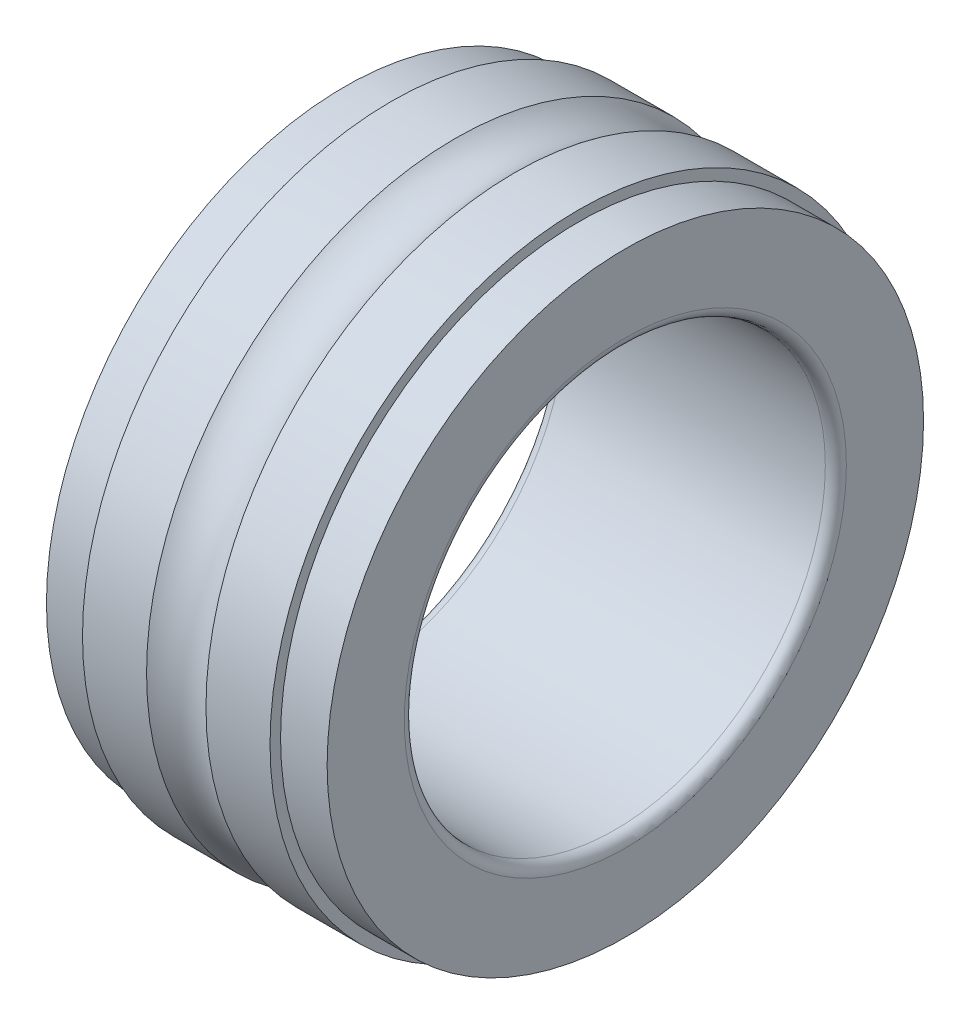
ISO-10303-21;
HEADER;
FILE_DESCRIPTION(('STEP AP214'),'2;1');
FILE_NAME('part.step','',(''),(''),'','','');
FILE_SCHEMA(('AUTOMOTIVE_DESIGN { 1 0 10303 214 1 1 1 1 }'));
ENDSEC;
DATA;
#1=APPLICATION_CONTEXT('core data for automotive mechanical design processes');
#2=APPLICATION_PROTOCOL_DEFINITION('international standard','automotive_design',2000,#1);
#3=PRODUCT_CONTEXT('',#1,'mechanical');
#4=PRODUCT('Part','Part','',(#3));
#5=PRODUCT_RELATED_PRODUCT_CATEGORY('part','',(#4));
#6=PRODUCT_DEFINITION_FORMATION('','',#4);
#7=PRODUCT_DEFINITION_CONTEXT('part definition',#1,'design');
#8=PRODUCT_DEFINITION('design','',#6,#7);
#9=PRODUCT_DEFINITION_SHAPE('','',#8);
#10=(LENGTH_UNIT() NAMED_UNIT(*) SI_UNIT(.MILLI.,.METRE.));
#11=(NAMED_UNIT(*) PLANE_ANGLE_UNIT() SI_UNIT($,.RADIAN.));
#12=(NAMED_UNIT(*) SI_UNIT($,.STERADIAN.) SOLID_ANGLE_UNIT());
#13=UNCERTAINTY_MEASURE_WITH_UNIT(LENGTH_MEASURE(1.E-05),#10,'distance_accuracy_value','');
#14=(GEOMETRIC_REPRESENTATION_CONTEXT(3) GLOBAL_UNCERTAINTY_ASSIGNED_CONTEXT((#13)) GLOBAL_UNIT_ASSIGNED_CONTEXT((#10,
#11,#12)) REPRESENTATION_CONTEXT('',''));
#15=CARTESIAN_POINT('',(0.,0.,0.));
#16=DIRECTION('',(0.,0.,1.));
#17=DIRECTION('',(1.,0.,0.));
#18=AXIS2_PLACEMENT_3D('',#15,#16,#17);
#19=CARTESIAN_POINT('',(1.,0.,0.));
#20=DIRECTION('',(1.,0.,0.));
#21=DIRECTION('',(0.,0.,1.));
#22=AXIS2_PLACEMENT_3D('',#19,#20,#21);
#23=TOROIDAL_SURFACE('',#22,9.845,1.345);
#24=CARTESIAN_POINT('',(1.846758525201,0.,0.));
#25=DIRECTION('',(-1.,0.,0.));
#26=DIRECTION('',(0.,0.,1.));
#27=AXIS2_PLACEMENT_3D('',#24,#25,#26);
#28=CIRCLE('',#27,8.8);
#29=CARTESIAN_POINT('',(1.846758525201,0.,8.8));
#30=VERTEX_POINT('',#29);
#31=CARTESIAN_POINT('',(1.846758525201,0.,-8.8));
#32=VERTEX_POINT('',#31);
#33=EDGE_CURVE('E159',#30,#32,#28,.T.);
#34=ORIENTED_EDGE('',*,*,#33,.T.);
#35=CARTESIAN_POINT('',(1.,0.,-9.845));
#36=DIRECTION('',(0.,-1.,0.));
#37=DIRECTION('',(0.,0.,-1.));
#38=AXIS2_PLACEMENT_3D('',#35,#36,#37);
#39=CIRCLE('',#38,1.345);
#40=CARTESIAN_POINT('',(0.1532414747993,0.,-8.8));
#41=VERTEX_POINT('',#40);
#42=EDGE_CURVE('E11',#32,#41,#39,.T.);
#43=ORIENTED_EDGE('',*,*,#42,.T.);
#44=CARTESIAN_POINT('',(0.1532414747993,0.,0.));
#45=DIRECTION('',(1.,0.,0.));
#46=DIRECTION('',(0.,0.,1.));
#47=AXIS2_PLACEMENT_3D('',#44,#45,#46);
#48=CIRCLE('',#47,8.8);
#49=CARTESIAN_POINT('',(0.1532414747993,0.,8.8));
#50=VERTEX_POINT('',#49);
#51=EDGE_CURVE('E142',#41,#50,#48,.T.);
#52=ORIENTED_EDGE('',*,*,#51,.T.);
#53=CARTESIAN_POINT('',(0.1532414747993,0.,0.));
#54=DIRECTION('',(1.,0.,0.));
#55=DIRECTION('',(0.,0.,1.));
#56=AXIS2_PLACEMENT_3D('',#53,#54,#55);
#57=CIRCLE('',#56,8.8);
#58=EDGE_CURVE('E122',#50,#41,#57,.T.);
#59=ORIENTED_EDGE('',*,*,#58,.T.);
#60=ORIENTED_EDGE('',*,*,#42,.F.);
#61=CARTESIAN_POINT('',(1.846758525201,0.,0.));
#62=DIRECTION('',(-1.,0.,0.));
#63=DIRECTION('',(0.,0.,1.));
#64=AXIS2_PLACEMENT_3D('',#61,#62,#63);
#65=CIRCLE('',#64,8.8);
#66=EDGE_CURVE('E28',#32,#30,#65,.T.);
#67=ORIENTED_EDGE('',*,*,#66,.T.);
#68=EDGE_LOOP('',(#34,#43,#52,#59,#60,#67));
#69=FACE_BOUND('',#68,.T.);
#70=ADVANCED_FACE('F17',(#69),#23,.F.);
#71=CARTESIAN_POINT('',(2.7596292626,0.,0.));
#72=DIRECTION('',(-1.,0.,0.));
#73=DIRECTION('',(0.,0.,-1.));
#74=AXIS2_PLACEMENT_3D('',#71,#72,#73);
#75=CYLINDRICAL_SURFACE('',#74,8.8);
#76=ORIENTED_EDGE('',*,*,#33,.F.);
#77=DIRECTION('',(1.,0.,0.));
#78=VECTOR('',#77,1.);
#79=CARTESIAN_POINT('',(2.7596292626,0.,8.8));
#80=LINE('',#79,#78);
#81=CARTESIAN_POINT('',(3.6725,0.,8.8));
#82=VERTEX_POINT('',#81);
#83=EDGE_CURVE('E126',#30,#82,#80,.T.);
#84=ORIENTED_EDGE('',*,*,#83,.T.);
#85=CARTESIAN_POINT('',(3.6725,0.,0.));
#86=DIRECTION('',(1.,0.,0.));
#87=DIRECTION('',(0.,0.,-1.));
#88=AXIS2_PLACEMENT_3D('',#85,#86,#87);
#89=CIRCLE('',#88,8.8);
#90=EDGE_CURVE('E155',#82,#82,#89,.T.);
#91=ORIENTED_EDGE('',*,*,#90,.F.);
#92=ORIENTED_EDGE('',*,*,#83,.F.);
#93=ORIENTED_EDGE('',*,*,#66,.F.);
#94=EDGE_LOOP('',(#76,#84,#91,#92,#93));
#95=FACE_BOUND('',#94,.T.);
#96=ADVANCED_FACE('F360',(#95),#75,.T.);
#97=CARTESIAN_POINT('',(3.6725,0.,-8.65));
#98=DIRECTION('',(1.,0.,0.));
#99=DIRECTION('',(0.,1.,0.));
#100=AXIS2_PLACEMENT_3D('',#97,#98,#99);
#101=PLANE('',#100);
#102=CARTESIAN_POINT('',(3.6725,0.,0.));
#103=DIRECTION('',(-1.,0.,0.));
#104=DIRECTION('',(0.,0.,1.));
#105=AXIS2_PLACEMENT_3D('',#102,#103,#104);
#106=CIRCLE('',#105,8.5);
#107=CARTESIAN_POINT('',(3.6725,0.,8.5));
#108=VERTEX_POINT('',#107);
#109=EDGE_CURVE('E150',#108,#108,#106,.T.);
#110=ORIENTED_EDGE('',*,*,#109,.T.);
#111=EDGE_LOOP('',(#110));
#112=FACE_BOUND('',#111,.T.);
#113=ORIENTED_EDGE('',*,*,#90,.T.);
#114=EDGE_LOOP('',(#113));
#115=FACE_BOUND('',#114,.T.);
#116=ADVANCED_FACE('F19',(#112,#115),#101,.T.);
#117=CARTESIAN_POINT('',(4.33625,0.,0.));
#118=DIRECTION('',(-1.,0.,0.));
#119=DIRECTION('',(0.,0.,-1.));
#120=AXIS2_PLACEMENT_3D('',#117,#118,#119);
#121=CYLINDRICAL_SURFACE('',#120,8.5);
#122=ORIENTED_EDGE('',*,*,#109,.F.);
#123=DIRECTION('',(1.,0.,0.));
#124=VECTOR('',#123,1.);
#125=CARTESIAN_POINT('',(4.33625,0.,8.5));
#126=LINE('',#125,#124);
#127=CARTESIAN_POINT('',(5.,0.,8.5));
#128=VERTEX_POINT('',#127);
#129=EDGE_CURVE('E58',#108,#128,#126,.T.);
#130=ORIENTED_EDGE('',*,*,#129,.T.);
#131=CARTESIAN_POINT('',(5.,0.,0.));
#132=DIRECTION('',(1.,0.,0.));
#133=DIRECTION('',(0.,0.,-1.));
#134=AXIS2_PLACEMENT_3D('',#131,#132,#133);
#135=CIRCLE('',#134,8.5);
#136=EDGE_CURVE('E153',#128,#128,#135,.T.);
#137=ORIENTED_EDGE('',*,*,#136,.F.);
#138=ORIENTED_EDGE('',*,*,#129,.F.);
#139=EDGE_LOOP('',(#122,#130,#137,#138));
#140=FACE_BOUND('',#139,.T.);
#141=ADVANCED_FACE('F343',(#140),#121,.T.);
#142=CARTESIAN_POINT('',(5.,0.,-7.4));
#143=DIRECTION('',(1.,0.,0.));
#144=DIRECTION('',(0.,1.,0.));
#145=AXIS2_PLACEMENT_3D('',#142,#143,#144);
#146=PLANE('',#145);
#147=CARTESIAN_POINT('',(5.,0.,0.));
#148=DIRECTION('',(-1.,0.,0.));
#149=DIRECTION('',(0.,0.,-1.));
#150=AXIS2_PLACEMENT_3D('',#147,#148,#149);
#151=CIRCLE('',#150,6.3);
#152=CARTESIAN_POINT('',(5.,0.,-6.3));
#153=VERTEX_POINT('',#152);
#154=EDGE_CURVE('E70',#153,#153,#151,.T.);
#155=ORIENTED_EDGE('',*,*,#154,.T.);
#156=EDGE_LOOP('',(#155));
#157=FACE_BOUND('',#156,.T.);
#158=ORIENTED_EDGE('',*,*,#136,.T.);
#159=EDGE_LOOP('',(#158));
#160=FACE_BOUND('',#159,.T.);
#161=ADVANCED_FACE('F333',(#157,#160),#146,.T.);
#162=CARTESIAN_POINT('',(4.7,0.,0.));
#163=DIRECTION('',(1.,0.,0.));
#164=DIRECTION('',(0.,0.,1.));
#165=AXIS2_PLACEMENT_3D('',#162,#163,#164);
#166=TOROIDAL_SURFACE('',#165,6.3,0.3);
#167=CARTESIAN_POINT('',(4.7,0.,0.));
#168=DIRECTION('',(-1.,0.,0.));
#169=DIRECTION('',(0.,0.,1.));
#170=AXIS2_PLACEMENT_3D('',#167,#168,#169);
#171=CIRCLE('',#170,6.);
#172=CARTESIAN_POINT('',(4.7,0.,6.));
#173=VERTEX_POINT('',#172);
#174=CARTESIAN_POINT('',(4.7,0.,-6.));
#175=VERTEX_POINT('',#174);
#176=EDGE_CURVE('E145',#173,#175,#171,.T.);
#177=ORIENTED_EDGE('',*,*,#176,.T.);
#178=CARTESIAN_POINT('',(4.7,0.,-6.3));
#179=DIRECTION('',(0.,1.,0.));
#180=DIRECTION('',(0.,0.,-1.));
#181=AXIS2_PLACEMENT_3D('',#178,#179,#180);
#182=CIRCLE('',#181,0.3);
#183=EDGE_CURVE('E172',#175,#153,#182,.T.);
#184=ORIENTED_EDGE('',*,*,#183,.T.);
#185=ORIENTED_EDGE('',*,*,#154,.F.);
#186=ORIENTED_EDGE('',*,*,#183,.F.);
#187=CARTESIAN_POINT('',(4.7,0.,0.));
#188=DIRECTION('',(-1.,0.,0.));
#189=DIRECTION('',(0.,0.,1.));
#190=AXIS2_PLACEMENT_3D('',#187,#188,#189);
#191=CIRCLE('',#190,6.);
#192=EDGE_CURVE('E21',#175,#173,#191,.T.);
#193=ORIENTED_EDGE('',*,*,#192,.T.);
#194=EDGE_LOOP('',(#177,#184,#185,#186,#193));
#195=FACE_BOUND('',#194,.T.);
#196=ADVANCED_FACE('F322',(#195),#166,.T.);
#197=CARTESIAN_POINT('',(1.,0.,0.));
#198=DIRECTION('',(-1.,0.,0.));
#199=DIRECTION('',(0.,0.,-1.));
#200=AXIS2_PLACEMENT_3D('',#197,#198,#199);
#201=CYLINDRICAL_SURFACE('',#200,6.);
#202=ORIENTED_EDGE('',*,*,#176,.F.);
#203=DIRECTION('',(-1.,0.,0.));
#204=VECTOR('',#203,1.);
#205=CARTESIAN_POINT('',(1.,0.,6.));
#206=LINE('',#205,#204);
#207=CARTESIAN_POINT('',(-2.7,0.,6.));
#208=VERTEX_POINT('',#207);
#209=EDGE_CURVE('E148',#173,#208,#206,.T.);
#210=ORIENTED_EDGE('',*,*,#209,.T.);
#211=CARTESIAN_POINT('',(-2.7,0.,0.));
#212=DIRECTION('',(1.,0.,0.));
#213=DIRECTION('',(0.,0.,1.));
#214=AXIS2_PLACEMENT_3D('',#211,#212,#213);
#215=CIRCLE('',#214,6.);
#216=CARTESIAN_POINT('',(-2.7,0.,-6.));
#217=VERTEX_POINT('',#216);
#218=EDGE_CURVE('E128',#217,#208,#215,.T.);
#219=ORIENTED_EDGE('',*,*,#218,.F.);
#220=CARTESIAN_POINT('',(-2.7,0.,0.));
#221=DIRECTION('',(1.,0.,0.));
#222=DIRECTION('',(0.,0.,1.));
#223=AXIS2_PLACEMENT_3D('',#220,#221,#222);
#224=CIRCLE('',#223,6.);
#225=EDGE_CURVE('E132',#208,#217,#224,.T.);
#226=ORIENTED_EDGE('',*,*,#225,.F.);
#227=ORIENTED_EDGE('',*,*,#209,.F.);
#228=ORIENTED_EDGE('',*,*,#192,.F.);
#229=EDGE_LOOP('',(#202,#210,#219,#226,#227,#228));
#230=FACE_BOUND('',#229,.T.);
#231=ADVANCED_FACE('F312',(#230),#201,.F.);
#232=CARTESIAN_POINT('',(-2.7,0.,0.));
#233=DIRECTION('',(1.,0.,0.));
#234=DIRECTION('',(0.,0.,1.));
#235=AXIS2_PLACEMENT_3D('',#232,#233,#234);
#236=TOROIDAL_SURFACE('',#235,6.3,0.3);
#237=CARTESIAN_POINT('',(-3.,0.,0.));
#238=DIRECTION('',(1.,0.,0.));
#239=DIRECTION('',(0.,0.,-1.));
#240=AXIS2_PLACEMENT_3D('',#237,#238,#239);
#241=CIRCLE('',#240,6.3);
#242=CARTESIAN_POINT('',(-3.,0.,-6.3));
#243=VERTEX_POINT('',#242);
#244=EDGE_CURVE('E112',#243,#243,#241,.T.);
#245=ORIENTED_EDGE('',*,*,#244,.F.);
#246=CARTESIAN_POINT('',(-2.7,0.,-6.3));
#247=DIRECTION('',(0.,1.,0.));
#248=DIRECTION('',(0.,0.,-1.));
#249=AXIS2_PLACEMENT_3D('',#246,#247,#248);
#250=CIRCLE('',#249,0.3);
#251=EDGE_CURVE('E94',#243,#217,#250,.T.);
#252=ORIENTED_EDGE('',*,*,#251,.T.);
#253=ORIENTED_EDGE('',*,*,#218,.T.);
#254=ORIENTED_EDGE('',*,*,#225,.T.);
#255=ORIENTED_EDGE('',*,*,#251,.F.);
#256=EDGE_LOOP('',(#245,#252,#253,#254,#255));
#257=FACE_BOUND('',#256,.T.);
#258=ADVANCED_FACE('F301',(#257),#236,.T.);
#259=CARTESIAN_POINT('',(-3.,0.,-7.4));
#260=DIRECTION('',(-1.,0.,0.));
#261=DIRECTION('',(0.,0.,1.));
#262=AXIS2_PLACEMENT_3D('',#259,#260,#261);
#263=PLANE('',#262);
#264=ORIENTED_EDGE('',*,*,#244,.T.);
#265=EDGE_LOOP('',(#264));
#266=FACE_BOUND('',#265,.T.);
#267=CARTESIAN_POINT('',(-3.,0.,0.));
#268=DIRECTION('',(-1.,0.,0.));
#269=DIRECTION('',(0.,0.,1.));
#270=AXIS2_PLACEMENT_3D('',#267,#268,#269);
#271=CIRCLE('',#270,8.5);
#272=CARTESIAN_POINT('',(-3.,0.,8.5));
#273=VERTEX_POINT('',#272);
#274=EDGE_CURVE('E108',#273,#273,#271,.T.);
#275=ORIENTED_EDGE('',*,*,#274,.T.);
#276=EDGE_LOOP('',(#275));
#277=FACE_BOUND('',#276,.T.);
#278=ADVANCED_FACE('F115',(#266,#277),#263,.T.);
#279=CARTESIAN_POINT('',(-2.33625,0.,0.));
#280=DIRECTION('',(-1.,0.,0.));
#281=DIRECTION('',(0.,0.,-1.));
#282=AXIS2_PLACEMENT_3D('',#279,#280,#281);
#283=CYLINDRICAL_SURFACE('',#282,8.5);
#284=ORIENTED_EDGE('',*,*,#274,.F.);
#285=DIRECTION('',(1.,0.,0.));
#286=VECTOR('',#285,1.);
#287=CARTESIAN_POINT('',(-2.33625,0.,8.5));
#288=LINE('',#287,#286);
#289=CARTESIAN_POINT('',(-1.6725,0.,8.5));
#290=VERTEX_POINT('',#289);
#291=EDGE_CURVE('E105',#273,#290,#288,.T.);
#292=ORIENTED_EDGE('',*,*,#291,.T.);
#293=CARTESIAN_POINT('',(-1.6725,0.,0.));
#294=DIRECTION('',(1.,0.,0.));
#295=DIRECTION('',(0.,0.,-1.));
#296=AXIS2_PLACEMENT_3D('',#293,#294,#295);
#297=CIRCLE('',#296,8.5);
#298=EDGE_CURVE('E110',#290,#290,#297,.T.);
#299=ORIENTED_EDGE('',*,*,#298,.F.);
#300=ORIENTED_EDGE('',*,*,#291,.F.);
#301=EDGE_LOOP('',(#284,#292,#299,#300));
#302=FACE_BOUND('',#301,.T.);
#303=ADVANCED_FACE('F107',(#302),#283,.T.);
#304=CARTESIAN_POINT('',(-1.6725,0.,-8.65));
#305=DIRECTION('',(-1.,0.,0.));
#306=DIRECTION('',(0.,0.,1.));
#307=AXIS2_PLACEMENT_3D('',#304,#305,#306);
#308=PLANE('',#307);
#309=ORIENTED_EDGE('',*,*,#298,.T.);
#310=EDGE_LOOP('',(#309));
#311=FACE_BOUND('',#310,.T.);
#312=CARTESIAN_POINT('',(-1.6725,0.,0.));
#313=DIRECTION('',(-1.,0.,0.));
#314=DIRECTION('',(0.,0.,1.));
#315=AXIS2_PLACEMENT_3D('',#312,#313,#314);
#316=CIRCLE('',#315,8.8);
#317=CARTESIAN_POINT('',(-1.6725,0.,8.8));
#318=VERTEX_POINT('',#317);
#319=EDGE_CURVE('E135',#318,#318,#316,.T.);
#320=ORIENTED_EDGE('',*,*,#319,.T.);
#321=EDGE_LOOP('',(#320));
#322=FACE_BOUND('',#321,.T.);
#323=ADVANCED_FACE('F267',(#311,#322),#308,.T.);
#324=CARTESIAN_POINT('',(-0.7596292626003,0.,0.));
#325=DIRECTION('',(-1.,0.,0.));
#326=DIRECTION('',(0.,0.,-1.));
#327=AXIS2_PLACEMENT_3D('',#324,#325,#326);
#328=CYLINDRICAL_SURFACE('',#327,8.8);
#329=ORIENTED_EDGE('',*,*,#319,.F.);
#330=DIRECTION('',(1.,0.,0.));
#331=VECTOR('',#330,1.);
#332=CARTESIAN_POINT('',(-0.7596292626003,0.,8.8));
#333=LINE('',#332,#331);
#334=EDGE_CURVE('E139',#318,#50,#333,.T.);
#335=ORIENTED_EDGE('',*,*,#334,.T.);
#336=ORIENTED_EDGE('',*,*,#51,.F.);
#337=ORIENTED_EDGE('',*,*,#58,.F.);
#338=ORIENTED_EDGE('',*,*,#334,.F.);
#339=EDGE_LOOP('',(#329,#335,#336,#337,#338));
#340=FACE_BOUND('',#339,.T.);
#341=ADVANCED_FACE('F261',(#340),#328,.T.);
#342=CLOSED_SHELL('',(#70,#96,#116,#141,#161,#196,#231,#258,#278,#303,#323,#341));
#343=MANIFOLD_SOLID_BREP('B1',#342);
#344=ADVANCED_BREP_SHAPE_REPRESENTATION('',(#18,#343),#14);
#345=SHAPE_DEFINITION_REPRESENTATION(#9,#344);
ENDSEC;
END-ISO-10303-21;
